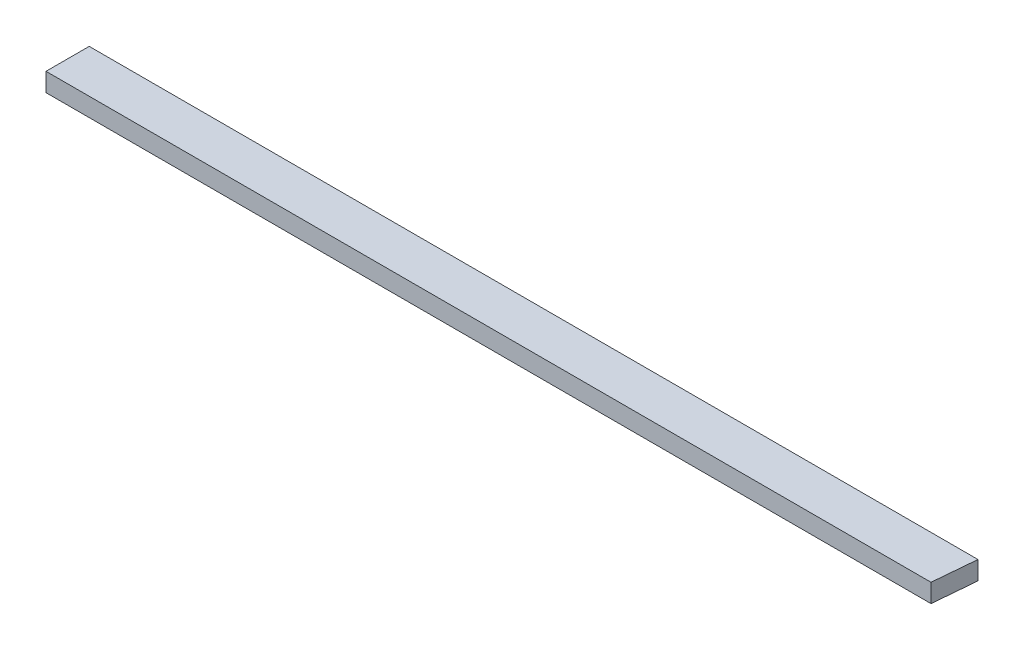
ISO-10303-21;
HEADER;
FILE_DESCRIPTION(('STEP AP214'),'2;1');
FILE_NAME('part.step','',(''),(''),'','','');
FILE_SCHEMA(('AUTOMOTIVE_DESIGN { 1 0 10303 214 1 1 1 1 }'));
ENDSEC;
DATA;
#1=APPLICATION_CONTEXT('core data for automotive mechanical design processes');
#2=APPLICATION_PROTOCOL_DEFINITION('international standard','automotive_design',2000,#1);
#3=PRODUCT_CONTEXT('',#1,'mechanical');
#4=PRODUCT('Part','Part','',(#3));
#5=PRODUCT_RELATED_PRODUCT_CATEGORY('part','',(#4));
#6=PRODUCT_DEFINITION_FORMATION('','',#4);
#7=PRODUCT_DEFINITION_CONTEXT('part definition',#1,'design');
#8=PRODUCT_DEFINITION('design','',#6,#7);
#9=PRODUCT_DEFINITION_SHAPE('','',#8);
#10=(LENGTH_UNIT() NAMED_UNIT(*) SI_UNIT(.MILLI.,.METRE.));
#11=(NAMED_UNIT(*) PLANE_ANGLE_UNIT() SI_UNIT($,.RADIAN.));
#12=(NAMED_UNIT(*) SI_UNIT($,.STERADIAN.) SOLID_ANGLE_UNIT());
#13=UNCERTAINTY_MEASURE_WITH_UNIT(LENGTH_MEASURE(1.E-05),#10,'distance_accuracy_value','');
#14=(GEOMETRIC_REPRESENTATION_CONTEXT(3) GLOBAL_UNCERTAINTY_ASSIGNED_CONTEXT((#13)) GLOBAL_UNIT_ASSIGNED_CONTEXT((#10,
#11,#12)) REPRESENTATION_CONTEXT('',''));
#15=CARTESIAN_POINT('',(0.,0.,0.));
#16=DIRECTION('',(0.,0.,1.));
#17=DIRECTION('',(1.,0.,0.));
#18=AXIS2_PLACEMENT_3D('',#15,#16,#17);
#19=CARTESIAN_POINT('',(0.,-38.1,0.));
#20=DIRECTION('',(-1.,0.,0.));
#21=DIRECTION('',(0.,0.,1.));
#22=AXIS2_PLACEMENT_3D('',#19,#20,#21);
#23=PLANE('',#22);
#24=DIRECTION('',(0.,0.,1.));
#25=VECTOR('',#24,1.);
#26=CARTESIAN_POINT('',(0.,0.,0.));
#27=LINE('',#26,#25);
#28=CARTESIAN_POINT('',(0.,0.,-88.9));
#29=VERTEX_POINT('',#28);
#30=CARTESIAN_POINT('',(0.,0.,0.));
#31=VERTEX_POINT('',#30);
#32=EDGE_CURVE('E110',#29,#31,#27,.T.);
#33=ORIENTED_EDGE('',*,*,#32,.F.);
#34=DIRECTION('',(0.,1.,0.));
#35=VECTOR('',#34,1.);
#36=CARTESIAN_POINT('',(0.,-38.1,-88.9));
#37=LINE('',#36,#35);
#38=CARTESIAN_POINT('',(0.,-38.1,-88.9));
#39=VERTEX_POINT('',#38);
#40=EDGE_CURVE('E11',#39,#29,#37,.T.);
#41=ORIENTED_EDGE('',*,*,#40,.F.);
#42=DIRECTION('',(0.,0.,1.));
#43=VECTOR('',#42,1.);
#44=CARTESIAN_POINT('',(0.,-38.1,0.));
#45=LINE('',#44,#43);
#46=CARTESIAN_POINT('',(0.,-38.1,0.));
#47=VERTEX_POINT('',#46);
#48=EDGE_CURVE('E101',#39,#47,#45,.T.);
#49=ORIENTED_EDGE('',*,*,#48,.T.);
#50=DIRECTION('',(0.,1.,0.));
#51=VECTOR('',#50,1.);
#52=CARTESIAN_POINT('',(0.,-38.1,0.));
#53=LINE('',#52,#51);
#54=EDGE_CURVE('E42',#47,#31,#53,.T.);
#55=ORIENTED_EDGE('',*,*,#54,.T.);
#56=EDGE_LOOP('',(#33,#41,#49,#55));
#57=FACE_BOUND('',#56,.T.);
#58=ADVANCED_FACE('F39',(#57),#23,.T.);
#59=CARTESIAN_POINT('',(0.,-38.1,-88.9));
#60=DIRECTION('',(0.,0.,-1.));
#61=DIRECTION('',(-1.,0.,0.));
#62=AXIS2_PLACEMENT_3D('',#59,#60,#61);
#63=PLANE('',#62);
#64=DIRECTION('',(-1.,0.,0.));
#65=VECTOR('',#64,1.);
#66=CARTESIAN_POINT('',(0.,0.,-88.9));
#67=LINE('',#66,#65);
#68=CARTESIAN_POINT('',(1828.8,0.,-88.9));
#69=VERTEX_POINT('',#68);
#70=EDGE_CURVE('E105',#69,#29,#67,.T.);
#71=ORIENTED_EDGE('',*,*,#70,.F.);
#72=DIRECTION('',(0.,1.,0.));
#73=VECTOR('',#72,1.);
#74=CARTESIAN_POINT('',(1828.8,-38.1,-88.9));
#75=LINE('',#74,#73);
#76=CARTESIAN_POINT('',(1828.8,-38.1,-88.9));
#77=VERTEX_POINT('',#76);
#78=EDGE_CURVE('E49',#77,#69,#75,.T.);
#79=ORIENTED_EDGE('',*,*,#78,.F.);
#80=DIRECTION('',(-1.,0.,0.));
#81=VECTOR('',#80,1.);
#82=CARTESIAN_POINT('',(0.,-38.1,-88.9));
#83=LINE('',#82,#81);
#84=EDGE_CURVE('E96',#77,#39,#83,.T.);
#85=ORIENTED_EDGE('',*,*,#84,.T.);
#86=ORIENTED_EDGE('',*,*,#40,.T.);
#87=EDGE_LOOP('',(#71,#79,#85,#86));
#88=FACE_BOUND('',#87,.T.);
#89=ADVANCED_FACE('F132',(#88),#63,.T.);
#90=CARTESIAN_POINT('',(1828.8,-38.1,-88.9));
#91=DIRECTION('',(0.996194698091745,0.,0.0871557427476618));
#92=DIRECTION('',(0.0871557427476618,0.,-0.996194698091745));
#93=AXIS2_PLACEMENT_3D('',#90,#91,#92);
#94=PLANE('',#93);
#95=DIRECTION('',(0.0871557427476618,0.,-0.996194698091745));
#96=VECTOR('',#95,1.);
#97=CARTESIAN_POINT('',(1828.8,0.,-88.9));
#98=LINE('',#97,#96);
#99=CARTESIAN_POINT('',(1821.02225781254,0.,0.));
#100=VERTEX_POINT('',#99);
#101=EDGE_CURVE('E90',#100,#69,#98,.T.);
#102=ORIENTED_EDGE('',*,*,#101,.F.);
#103=DIRECTION('',(0.,1.,0.));
#104=VECTOR('',#103,1.);
#105=CARTESIAN_POINT('',(1821.02225781254,-38.1,0.));
#106=LINE('',#105,#104);
#107=CARTESIAN_POINT('',(1821.02225781254,-38.1,0.));
#108=VERTEX_POINT('',#107);
#109=EDGE_CURVE('E85',#108,#100,#106,.T.);
#110=ORIENTED_EDGE('',*,*,#109,.F.);
#111=DIRECTION('',(0.0871557427476618,0.,-0.996194698091745));
#112=VECTOR('',#111,1.);
#113=CARTESIAN_POINT('',(1828.8,-38.1,-88.9));
#114=LINE('',#113,#112);
#115=EDGE_CURVE('E88',#108,#77,#114,.T.);
#116=ORIENTED_EDGE('',*,*,#115,.T.);
#117=ORIENTED_EDGE('',*,*,#78,.T.);
#118=EDGE_LOOP('',(#102,#110,#116,#117));
#119=FACE_BOUND('',#118,.T.);
#120=ADVANCED_FACE('F87',(#119),#94,.T.);
#121=CARTESIAN_POINT('',(0.,-38.1,0.));
#122=DIRECTION('',(0.,0.,1.));
#123=DIRECTION('',(1.,0.,0.));
#124=AXIS2_PLACEMENT_3D('',#121,#122,#123);
#125=PLANE('',#124);
#126=DIRECTION('',(1.,0.,0.));
#127=VECTOR('',#126,1.);
#128=CARTESIAN_POINT('',(0.,0.,0.));
#129=LINE('',#128,#127);
#130=EDGE_CURVE('E114',#31,#100,#129,.T.);
#131=ORIENTED_EDGE('',*,*,#130,.F.);
#132=ORIENTED_EDGE('',*,*,#54,.F.);
#133=DIRECTION('',(1.,0.,0.));
#134=VECTOR('',#133,1.);
#135=CARTESIAN_POINT('',(0.,-38.1,0.));
#136=LINE('',#135,#134);
#137=EDGE_CURVE('E95',#47,#108,#136,.T.);
#138=ORIENTED_EDGE('',*,*,#137,.T.);
#139=ORIENTED_EDGE('',*,*,#109,.T.);
#140=EDGE_LOOP('',(#131,#132,#138,#139));
#141=FACE_BOUND('',#140,.T.);
#142=ADVANCED_FACE('F99',(#141),#125,.T.);
#143=CARTESIAN_POINT('',(0.,-38.1,0.));
#144=DIRECTION('',(0.,-1.,0.));
#145=DIRECTION('',(0.,0.,-1.));
#146=AXIS2_PLACEMENT_3D('',#143,#144,#145);
#147=PLANE('',#146);
#148=ORIENTED_EDGE('',*,*,#48,.F.);
#149=ORIENTED_EDGE('',*,*,#84,.F.);
#150=ORIENTED_EDGE('',*,*,#115,.F.);
#151=ORIENTED_EDGE('',*,*,#137,.F.);
#152=EDGE_LOOP('',(#148,#149,#150,#151));
#153=FACE_BOUND('',#152,.T.);
#154=ADVANCED_FACE('F94',(#153),#147,.T.);
#155=CARTESIAN_POINT('',(0.,0.,0.));
#156=DIRECTION('',(0.,-1.,0.));
#157=DIRECTION('',(0.,0.,-1.));
#158=AXIS2_PLACEMENT_3D('',#155,#156,#157);
#159=PLANE('',#158);
#160=ORIENTED_EDGE('',*,*,#32,.T.);
#161=ORIENTED_EDGE('',*,*,#130,.T.);
#162=ORIENTED_EDGE('',*,*,#101,.T.);
#163=ORIENTED_EDGE('',*,*,#70,.T.);
#164=EDGE_LOOP('',(#160,#161,#162,#163));
#165=FACE_BOUND('',#164,.T.);
#166=ADVANCED_FACE('F131',(#165),#159,.F.);
#167=CLOSED_SHELL('',(#58,#89,#120,#142,#154,#166));
#168=MANIFOLD_SOLID_BREP('B2',#167);
#169=ADVANCED_BREP_SHAPE_REPRESENTATION('',(#18,#168),#14);
#170=SHAPE_DEFINITION_REPRESENTATION(#9,#169);
ENDSEC;
END-ISO-10303-21;
